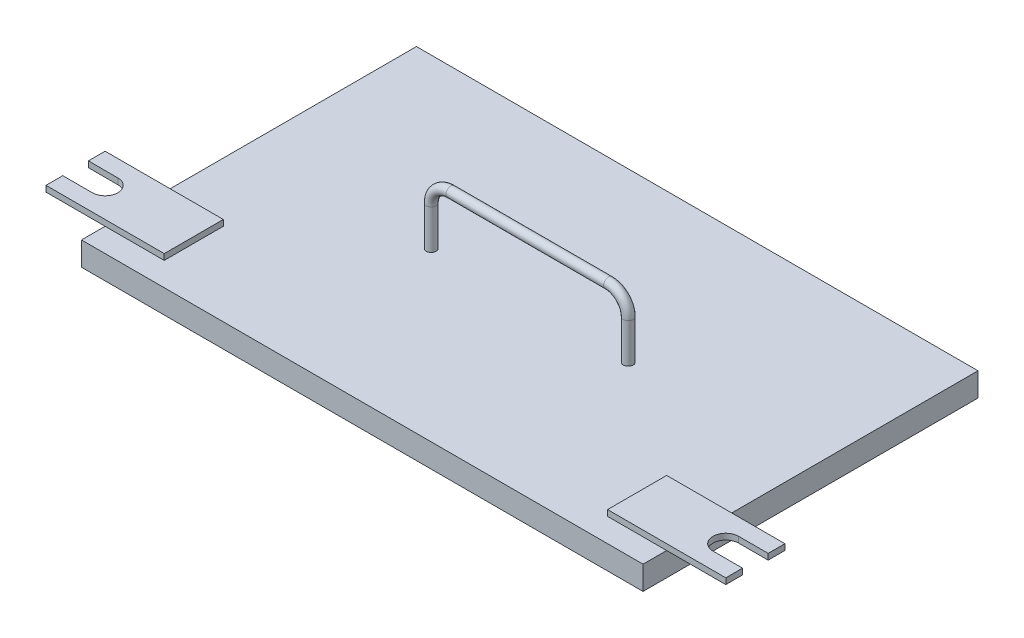
ISO-10303-21;
HEADER;
FILE_DESCRIPTION(('STEP AP214'),'2;1');
FILE_NAME('part.step','',(''),(''),'','','');
FILE_SCHEMA(('AUTOMOTIVE_DESIGN { 1 0 10303 214 1 1 1 1 }'));
ENDSEC;
DATA;
#1=APPLICATION_CONTEXT('core data for automotive mechanical design processes');
#2=APPLICATION_PROTOCOL_DEFINITION('international standard','automotive_design',2000,#1);
#3=PRODUCT_CONTEXT('',#1,'mechanical');
#4=PRODUCT('Part','Part','',(#3));
#5=PRODUCT_RELATED_PRODUCT_CATEGORY('part','',(#4));
#6=PRODUCT_DEFINITION_FORMATION('','',#4);
#7=PRODUCT_DEFINITION_CONTEXT('part definition',#1,'design');
#8=PRODUCT_DEFINITION('design','',#6,#7);
#9=PRODUCT_DEFINITION_SHAPE('','',#8);
#10=(LENGTH_UNIT() NAMED_UNIT(*) SI_UNIT(.MILLI.,.METRE.));
#11=(NAMED_UNIT(*) PLANE_ANGLE_UNIT() SI_UNIT($,.RADIAN.));
#12=(NAMED_UNIT(*) SI_UNIT($,.STERADIAN.) SOLID_ANGLE_UNIT());
#13=UNCERTAINTY_MEASURE_WITH_UNIT(LENGTH_MEASURE(1.E-05),#10,'distance_accuracy_value','');
#14=(GEOMETRIC_REPRESENTATION_CONTEXT(3) GLOBAL_UNCERTAINTY_ASSIGNED_CONTEXT((#13)) GLOBAL_UNIT_ASSIGNED_CONTEXT((#10,
#11,#12)) REPRESENTATION_CONTEXT('',''));
#15=CARTESIAN_POINT('',(0.,0.,0.));
#16=DIRECTION('',(0.,0.,1.));
#17=DIRECTION('',(1.,0.,0.));
#18=AXIS2_PLACEMENT_3D('',#15,#16,#17);
#19=CARTESIAN_POINT('',(-172.5,15.,43.0000000000003));
#20=DIRECTION('',(1.,0.,0.));
#21=DIRECTION('',(0.,0.,-1.));
#22=AXIS2_PLACEMENT_3D('',#19,#20,#21);
#23=PLANE('',#22);
#24=DIRECTION('',(0.,0.,1.));
#25=VECTOR('',#24,1.);
#26=CARTESIAN_POINT('',(-172.5,15.,43.0000000000003));
#27=LINE('',#26,#25);
#28=CARTESIAN_POINT('',(-172.5,15.0000000000001,64.5));
#29=VERTEX_POINT('',#28);
#30=CARTESIAN_POINT('',(-172.5,15.,73.0000000000003));
#31=VERTEX_POINT('',#30);
#32=EDGE_CURVE('E228',#29,#31,#27,.T.);
#33=ORIENTED_EDGE('',*,*,#32,.F.);
#34=DIRECTION('',(0.,-1.,0.));
#35=VECTOR('',#34,1.);
#36=CARTESIAN_POINT('',(-172.5,502.719991967477,64.5));
#37=LINE('',#36,#35);
#38=CARTESIAN_POINT('',(-172.5,12.0000000000001,64.5));
#39=VERTEX_POINT('',#38);
#40=EDGE_CURVE('E188',#29,#39,#37,.T.);
#41=ORIENTED_EDGE('',*,*,#40,.T.);
#42=DIRECTION('',(0.,0.,1.));
#43=VECTOR('',#42,1.);
#44=CARTESIAN_POINT('',(-172.5,12.,43.0000000000003));
#45=LINE('',#44,#43);
#46=CARTESIAN_POINT('',(-172.5,12.,73.0000000000003));
#47=VERTEX_POINT('',#46);
#48=EDGE_CURVE('E241',#39,#47,#45,.T.);
#49=ORIENTED_EDGE('',*,*,#48,.T.);
#50=DIRECTION('',(0.,-1.,0.));
#51=VECTOR('',#50,1.);
#52=CARTESIAN_POINT('',(-172.5,15.,73.0000000000003));
#53=LINE('',#52,#51);
#54=EDGE_CURVE('E249',#31,#47,#53,.T.);
#55=ORIENTED_EDGE('',*,*,#54,.F.);
#56=EDGE_LOOP('',(#33,#41,#49,#55));
#57=FACE_BOUND('',#56,.T.);
#58=ADVANCED_FACE('F32',(#57),#23,.F.);
#59=CARTESIAN_POINT('',(0.,12.,0.));
#60=DIRECTION('',(0.,1.,0.));
#61=DIRECTION('',(0.,0.,1.));
#62=AXIS2_PLACEMENT_3D('',#59,#60,#61);
#63=PLANE('',#62);
#64=DIRECTION('',(-1.,0.,0.));
#65=VECTOR('',#64,1.);
#66=CARTESIAN_POINT('',(0.,12.,64.4999999999998));
#67=LINE('',#66,#65);
#68=CARTESIAN_POINT('',(172.5,12.0000000000001,64.5));
#69=VERTEX_POINT('',#68);
#70=CARTESIAN_POINT('',(157.5,12.0000000000001,64.5));
#71=VERTEX_POINT('',#70);
#72=EDGE_CURVE('E219',#69,#71,#67,.T.);
#73=ORIENTED_EDGE('',*,*,#72,.F.);
#74=DIRECTION('',(0.,0.,-1.));
#75=VECTOR('',#74,1.);
#76=CARTESIAN_POINT('',(172.5,12.,43.));
#77=LINE('',#76,#75);
#78=CARTESIAN_POINT('',(172.5,12.,73.));
#79=VERTEX_POINT('',#78);
#80=EDGE_CURVE('E270',#79,#69,#77,.T.);
#81=ORIENTED_EDGE('',*,*,#80,.F.);
#82=DIRECTION('',(1.,0.,0.));
#83=VECTOR('',#82,1.);
#84=CARTESIAN_POINT('',(112.5,12.,73.));
#85=LINE('',#84,#83);
#86=CARTESIAN_POINT('',(142.5,12.,73.));
#87=VERTEX_POINT('',#86);
#88=EDGE_CURVE('E280',#87,#79,#85,.T.);
#89=ORIENTED_EDGE('',*,*,#88,.F.);
#90=DIRECTION('',(0.,0.,-1.));
#91=VECTOR('',#90,1.);
#92=CARTESIAN_POINT('',(142.5,12.,-85.));
#93=LINE('',#92,#91);
#94=CARTESIAN_POINT('',(142.5,12.,43.));
#95=VERTEX_POINT('',#94);
#96=EDGE_CURVE('E328',#87,#95,#93,.T.);
#97=ORIENTED_EDGE('',*,*,#96,.T.);
#98=DIRECTION('',(-1.,0.,0.));
#99=VECTOR('',#98,1.);
#100=CARTESIAN_POINT('',(112.5,12.,43.));
#101=LINE('',#100,#99);
#102=CARTESIAN_POINT('',(172.5,12.,43.));
#103=VERTEX_POINT('',#102);
#104=EDGE_CURVE('E274',#103,#95,#101,.T.);
#105=ORIENTED_EDGE('',*,*,#104,.F.);
#106=CARTESIAN_POINT('',(172.5,12.0000000000001,51.5));
#107=VERTEX_POINT('',#106);
#108=EDGE_CURVE('E258',#107,#103,#77,.T.);
#109=ORIENTED_EDGE('',*,*,#108,.F.);
#110=DIRECTION('',(1.,0.,0.));
#111=VECTOR('',#110,1.);
#112=CARTESIAN_POINT('',(0.,12.,51.5000000000002));
#113=LINE('',#112,#111);
#114=CARTESIAN_POINT('',(157.5,12.0000000000001,51.5));
#115=VERTEX_POINT('',#114);
#116=EDGE_CURVE('E215',#115,#107,#113,.T.);
#117=ORIENTED_EDGE('',*,*,#116,.F.);
#118=CARTESIAN_POINT('',(157.5,12.,58.));
#119=DIRECTION('',(0.,1.,0.));
#120=DIRECTION('',(0.,0.,1.));
#121=AXIS2_PLACEMENT_3D('',#118,#119,#120);
#122=CIRCLE('',#121,6.49999999999998);
#123=EDGE_CURVE('E217',#71,#115,#122,.F.);
#124=ORIENTED_EDGE('',*,*,#123,.F.);
#125=EDGE_LOOP('',(#73,#81,#89,#97,#105,#109,#117,#124));
#126=FACE_BOUND('',#125,.T.);
#127=ADVANCED_FACE('F410',(#126),#63,.F.);
#128=CARTESIAN_POINT('',(172.5,15.,43.));
#129=DIRECTION('',(-1.,0.,0.));
#130=DIRECTION('',(0.,0.,1.));
#131=AXIS2_PLACEMENT_3D('',#128,#129,#130);
#132=PLANE('',#131);
#133=DIRECTION('',(0.,-1.,0.));
#134=VECTOR('',#133,1.);
#135=CARTESIAN_POINT('',(172.5,502.719991967477,64.5));
#136=LINE('',#135,#134);
#137=CARTESIAN_POINT('',(172.5,15.0000000000001,64.5));
#138=VERTEX_POINT('',#137);
#139=EDGE_CURVE('E213',#138,#69,#136,.T.);
#140=ORIENTED_EDGE('',*,*,#139,.F.);
#141=DIRECTION('',(0.,0.,-1.));
#142=VECTOR('',#141,1.);
#143=CARTESIAN_POINT('',(172.5,15.,43.));
#144=LINE('',#143,#142);
#145=CARTESIAN_POINT('',(172.5,15.,73.));
#146=VERTEX_POINT('',#145);
#147=EDGE_CURVE('E259',#146,#138,#144,.T.);
#148=ORIENTED_EDGE('',*,*,#147,.F.);
#149=DIRECTION('',(0.,-1.,0.));
#150=VECTOR('',#149,1.);
#151=CARTESIAN_POINT('',(172.5,15.,73.));
#152=LINE('',#151,#150);
#153=EDGE_CURVE('E269',#146,#79,#152,.T.);
#154=ORIENTED_EDGE('',*,*,#153,.T.);
#155=ORIENTED_EDGE('',*,*,#80,.T.);
#156=EDGE_LOOP('',(#140,#148,#154,#155));
#157=FACE_BOUND('',#156,.T.);
#158=ADVANCED_FACE('F443',(#157),#132,.F.);
#159=DIRECTION('',(0.,-1.,0.));
#160=VECTOR('',#159,1.);
#161=CARTESIAN_POINT('',(172.5,502.719991967477,51.5));
#162=LINE('',#161,#160);
#163=CARTESIAN_POINT('',(172.5,15.,51.5));
#164=VERTEX_POINT('',#163);
#165=EDGE_CURVE('E55',#164,#107,#162,.T.);
#166=ORIENTED_EDGE('',*,*,#165,.T.);
#167=ORIENTED_EDGE('',*,*,#108,.T.);
#168=DIRECTION('',(0.,-1.,0.));
#169=VECTOR('',#168,1.);
#170=CARTESIAN_POINT('',(172.5,15.,43.));
#171=LINE('',#170,#169);
#172=CARTESIAN_POINT('',(172.5,15.,43.));
#173=VERTEX_POINT('',#172);
#174=EDGE_CURVE('E292',#173,#103,#171,.T.);
#175=ORIENTED_EDGE('',*,*,#174,.F.);
#176=EDGE_CURVE('E263',#164,#173,#144,.T.);
#177=ORIENTED_EDGE('',*,*,#176,.F.);
#178=EDGE_LOOP('',(#166,#167,#175,#177));
#179=FACE_BOUND('',#178,.T.);
#180=ADVANCED_FACE('F431',(#179),#132,.F.);
#181=CARTESIAN_POINT('',(0.,15.,0.));
#182=DIRECTION('',(0.,1.,0.));
#183=DIRECTION('',(0.,0.,1.));
#184=AXIS2_PLACEMENT_3D('',#181,#182,#183);
#185=PLANE('',#184);
#186=ORIENTED_EDGE('',*,*,#147,.T.);
#187=DIRECTION('',(-1.,0.,0.));
#188=VECTOR('',#187,1.);
#189=CARTESIAN_POINT('',(0.,15.,64.4999999999998));
#190=LINE('',#189,#188);
#191=CARTESIAN_POINT('',(157.5,15.0000000000001,64.5));
#192=VERTEX_POINT('',#191);
#193=EDGE_CURVE('E353',#138,#192,#190,.T.);
#194=ORIENTED_EDGE('',*,*,#193,.T.);
#195=CARTESIAN_POINT('',(157.5,15.,58.));
#196=DIRECTION('',(0.,1.,0.));
#197=DIRECTION('',(0.,0.,1.));
#198=AXIS2_PLACEMENT_3D('',#195,#196,#197);
#199=CIRCLE('',#198,6.49999999999998);
#200=CARTESIAN_POINT('',(157.5,15.0000000000001,51.5));
#201=VERTEX_POINT('',#200);
#202=EDGE_CURVE('E350',#192,#201,#199,.F.);
#203=ORIENTED_EDGE('',*,*,#202,.T.);
#204=DIRECTION('',(1.,0.,0.));
#205=VECTOR('',#204,1.);
#206=CARTESIAN_POINT('',(0.,15.,51.5000000000002));
#207=LINE('',#206,#205);
#208=EDGE_CURVE('E314',#201,#164,#207,.T.);
#209=ORIENTED_EDGE('',*,*,#208,.T.);
#210=ORIENTED_EDGE('',*,*,#176,.T.);
#211=DIRECTION('',(-1.,0.,0.));
#212=VECTOR('',#211,1.);
#213=CARTESIAN_POINT('',(112.5,15.,43.));
#214=LINE('',#213,#212);
#215=CARTESIAN_POINT('',(112.5,15.,43.));
#216=VERTEX_POINT('',#215);
#217=EDGE_CURVE('E262',#173,#216,#214,.T.);
#218=ORIENTED_EDGE('',*,*,#217,.T.);
#219=DIRECTION('',(0.,0.,1.));
#220=VECTOR('',#219,1.);
#221=CARTESIAN_POINT('',(112.5,15.,43.));
#222=LINE('',#221,#220);
#223=CARTESIAN_POINT('',(112.5,15.,73.));
#224=VERTEX_POINT('',#223);
#225=EDGE_CURVE('E265',#216,#224,#222,.T.);
#226=ORIENTED_EDGE('',*,*,#225,.T.);
#227=DIRECTION('',(1.,0.,0.));
#228=VECTOR('',#227,1.);
#229=CARTESIAN_POINT('',(112.5,15.,73.));
#230=LINE('',#229,#228);
#231=EDGE_CURVE('E267',#224,#146,#230,.T.);
#232=ORIENTED_EDGE('',*,*,#231,.T.);
#233=EDGE_LOOP('',(#186,#194,#203,#209,#210,#218,#226,#232));
#234=FACE_BOUND('',#233,.T.);
#235=ADVANCED_FACE('F434',(#234),#185,.T.);
#236=CARTESIAN_POINT('',(0.,12.,0.));
#237=DIRECTION('',(0.,-1.,0.));
#238=DIRECTION('',(0.,0.,-1.));
#239=AXIS2_PLACEMENT_3D('',#236,#237,#238);
#240=PLANE('',#239);
#241=CARTESIAN_POINT('',(-50.,12.,0.));
#242=DIRECTION('',(0.,1.,0.));
#243=DIRECTION('',(0.,0.,1.));
#244=AXIS2_PLACEMENT_3D('',#241,#242,#243);
#245=CIRCLE('',#244,2.49999999999999);
#246=CARTESIAN_POINT('',(-50.,12.,2.49999999999999));
#247=VERTEX_POINT('',#246);
#248=EDGE_CURVE('E311',#247,#247,#245,.T.);
#249=ORIENTED_EDGE('',*,*,#248,.F.);
#250=EDGE_LOOP('',(#249));
#251=FACE_BOUND('',#250,.T.);
#252=CARTESIAN_POINT('',(50.0000000000002,12.0000000000004,0.));
#253=DIRECTION('',(0.,-1.,0.));
#254=DIRECTION('',(0.,0.,1.));
#255=AXIS2_PLACEMENT_3D('',#252,#253,#254);
#256=CIRCLE('',#255,2.49999999999999);
#257=CARTESIAN_POINT('',(50.0000000000002,12.0000000000004,2.49999999999999));
#258=VERTEX_POINT('',#257);
#259=EDGE_CURVE('E295',#258,#258,#256,.T.);
#260=ORIENTED_EDGE('',*,*,#259,.T.);
#261=EDGE_LOOP('',(#260));
#262=FACE_BOUND('',#261,.T.);
#263=DIRECTION('',(-1.,0.,0.));
#264=VECTOR('',#263,1.);
#265=CARTESIAN_POINT('',(-112.5,12.,43.0000000000002));
#266=LINE('',#265,#264);
#267=CARTESIAN_POINT('',(-112.5,12.,43.0000000000002));
#268=VERTEX_POINT('',#267);
#269=CARTESIAN_POINT('',(-142.5,12.,43.0000000000002));
#270=VERTEX_POINT('',#269);
#271=EDGE_CURVE('E238',#268,#270,#266,.T.);
#272=ORIENTED_EDGE('',*,*,#271,.F.);
#273=DIRECTION('',(0.,0.,-1.));
#274=VECTOR('',#273,1.);
#275=CARTESIAN_POINT('',(-112.5,12.,43.0000000000002));
#276=LINE('',#275,#274);
#277=CARTESIAN_POINT('',(-112.5,12.,73.0000000000002));
#278=VERTEX_POINT('',#277);
#279=EDGE_CURVE('E221',#278,#268,#276,.T.);
#280=ORIENTED_EDGE('',*,*,#279,.F.);
#281=DIRECTION('',(1.,0.,0.));
#282=VECTOR('',#281,1.);
#283=CARTESIAN_POINT('',(-112.5,12.,73.0000000000002));
#284=LINE('',#283,#282);
#285=CARTESIAN_POINT('',(-142.5,12.,73.0000000000003));
#286=VERTEX_POINT('',#285);
#287=EDGE_CURVE('E244',#286,#278,#284,.T.);
#288=ORIENTED_EDGE('',*,*,#287,.F.);
#289=DIRECTION('',(0.,0.,1.));
#290=VECTOR('',#289,1.);
#291=CARTESIAN_POINT('',(-142.5,12.,-85.));
#292=LINE('',#291,#290);
#293=CARTESIAN_POINT('',(-142.5,12.,85.));
#294=VERTEX_POINT('',#293);
#295=EDGE_CURVE('E321',#286,#294,#292,.T.);
#296=ORIENTED_EDGE('',*,*,#295,.T.);
#297=DIRECTION('',(1.,0.,0.));
#298=VECTOR('',#297,1.);
#299=CARTESIAN_POINT('',(142.5,12.,85.));
#300=LINE('',#299,#298);
#301=CARTESIAN_POINT('',(142.5,12.,85.));
#302=VERTEX_POINT('',#301);
#303=EDGE_CURVE('E319',#294,#302,#300,.T.);
#304=ORIENTED_EDGE('',*,*,#303,.T.);
#305=EDGE_CURVE('E324',#302,#87,#93,.T.);
#306=ORIENTED_EDGE('',*,*,#305,.T.);
#307=CARTESIAN_POINT('',(112.5,12.,73.));
#308=VERTEX_POINT('',#307);
#309=EDGE_CURVE('E281',#308,#87,#85,.T.);
#310=ORIENTED_EDGE('',*,*,#309,.F.);
#311=DIRECTION('',(0.,0.,1.));
#312=VECTOR('',#311,1.);
#313=CARTESIAN_POINT('',(112.5,12.,43.));
#314=LINE('',#313,#312);
#315=CARTESIAN_POINT('',(112.5,12.,43.));
#316=VERTEX_POINT('',#315);
#317=EDGE_CURVE('E277',#316,#308,#314,.T.);
#318=ORIENTED_EDGE('',*,*,#317,.F.);
#319=EDGE_CURVE('E273',#95,#316,#101,.T.);
#320=ORIENTED_EDGE('',*,*,#319,.F.);
#321=CARTESIAN_POINT('',(142.5,12.,-85.));
#322=VERTEX_POINT('',#321);
#323=EDGE_CURVE('E323',#95,#322,#93,.T.);
#324=ORIENTED_EDGE('',*,*,#323,.T.);
#325=DIRECTION('',(-1.,0.,0.));
#326=VECTOR('',#325,1.);
#327=CARTESIAN_POINT('',(142.5,12.,-85.));
#328=LINE('',#327,#326);
#329=CARTESIAN_POINT('',(-142.5,12.,-85.));
#330=VERTEX_POINT('',#329);
#331=EDGE_CURVE('E327',#322,#330,#328,.T.);
#332=ORIENTED_EDGE('',*,*,#331,.T.);
#333=EDGE_CURVE('E316',#330,#270,#292,.T.);
#334=ORIENTED_EDGE('',*,*,#333,.T.);
#335=EDGE_LOOP('',(#272,#280,#288,#296,#304,#306,#310,#318,#320,#324,#332,#334));
#336=FACE_BOUND('',#335,.T.);
#337=ADVANCED_FACE('F386',(#251,#262,#336),#240,.F.);
#338=CARTESIAN_POINT('',(-142.5,12.,-85.));
#339=DIRECTION('',(1.,0.,0.));
#340=DIRECTION('',(0.,0.,-1.));
#341=AXIS2_PLACEMENT_3D('',#338,#339,#340);
#342=PLANE('',#341);
#343=DIRECTION('',(0.,0.,1.));
#344=VECTOR('',#343,1.);
#345=CARTESIAN_POINT('',(-142.5,0.,-85.));
#346=LINE('',#345,#344);
#347=CARTESIAN_POINT('',(-142.5,0.,-85.));
#348=VERTEX_POINT('',#347);
#349=CARTESIAN_POINT('',(-142.5,0.,85.));
#350=VERTEX_POINT('',#349);
#351=EDGE_CURVE('E310',#348,#350,#346,.T.);
#352=ORIENTED_EDGE('',*,*,#351,.T.);
#353=DIRECTION('',(0.,-1.,0.));
#354=VECTOR('',#353,1.);
#355=CARTESIAN_POINT('',(-142.5,12.,85.));
#356=LINE('',#355,#354);
#357=EDGE_CURVE('E315',#294,#350,#356,.T.);
#358=ORIENTED_EDGE('',*,*,#357,.F.);
#359=ORIENTED_EDGE('',*,*,#295,.F.);
#360=EDGE_CURVE('E320',#270,#286,#292,.T.);
#361=ORIENTED_EDGE('',*,*,#360,.F.);
#362=ORIENTED_EDGE('',*,*,#333,.F.);
#363=DIRECTION('',(0.,-1.,0.));
#364=VECTOR('',#363,1.);
#365=CARTESIAN_POINT('',(-142.5,12.,-85.));
#366=LINE('',#365,#364);
#367=EDGE_CURVE('E330',#330,#348,#366,.T.);
#368=ORIENTED_EDGE('',*,*,#367,.T.);
#369=EDGE_LOOP('',(#352,#358,#359,#361,#362,#368));
#370=FACE_BOUND('',#369,.T.);
#371=ADVANCED_FACE('F34',(#370),#342,.F.);
#372=CARTESIAN_POINT('',(142.5,12.,85.));
#373=DIRECTION('',(0.,0.,-1.));
#374=DIRECTION('',(-1.,0.,0.));
#375=AXIS2_PLACEMENT_3D('',#372,#373,#374);
#376=PLANE('',#375);
#377=DIRECTION('',(1.,0.,0.));
#378=VECTOR('',#377,1.);
#379=CARTESIAN_POINT('',(142.5,0.,85.));
#380=LINE('',#379,#378);
#381=CARTESIAN_POINT('',(142.5,0.,85.));
#382=VERTEX_POINT('',#381);
#383=EDGE_CURVE('E333',#350,#382,#380,.T.);
#384=ORIENTED_EDGE('',*,*,#383,.T.);
#385=DIRECTION('',(0.,-1.,0.));
#386=VECTOR('',#385,1.);
#387=CARTESIAN_POINT('',(142.5,12.,85.));
#388=LINE('',#387,#386);
#389=EDGE_CURVE('E344',#302,#382,#388,.T.);
#390=ORIENTED_EDGE('',*,*,#389,.F.);
#391=ORIENTED_EDGE('',*,*,#303,.F.);
#392=ORIENTED_EDGE('',*,*,#357,.T.);
#393=EDGE_LOOP('',(#384,#390,#391,#392));
#394=FACE_BOUND('',#393,.T.);
#395=ADVANCED_FACE('F396',(#394),#376,.F.);
#396=CARTESIAN_POINT('',(142.5,12.,-85.));
#397=DIRECTION('',(-1.,0.,0.));
#398=DIRECTION('',(0.,0.,1.));
#399=AXIS2_PLACEMENT_3D('',#396,#397,#398);
#400=PLANE('',#399);
#401=DIRECTION('',(0.,0.,-1.));
#402=VECTOR('',#401,1.);
#403=CARTESIAN_POINT('',(142.5,0.,-85.));
#404=LINE('',#403,#402);
#405=CARTESIAN_POINT('',(142.5,0.,-85.));
#406=VERTEX_POINT('',#405);
#407=EDGE_CURVE('E335',#382,#406,#404,.T.);
#408=ORIENTED_EDGE('',*,*,#407,.T.);
#409=DIRECTION('',(0.,-1.,0.));
#410=VECTOR('',#409,1.);
#411=CARTESIAN_POINT('',(142.5,12.,-85.));
#412=LINE('',#411,#410);
#413=EDGE_CURVE('E341',#322,#406,#412,.T.);
#414=ORIENTED_EDGE('',*,*,#413,.F.);
#415=ORIENTED_EDGE('',*,*,#323,.F.);
#416=ORIENTED_EDGE('',*,*,#96,.F.);
#417=ORIENTED_EDGE('',*,*,#305,.F.);
#418=ORIENTED_EDGE('',*,*,#389,.T.);
#419=EDGE_LOOP('',(#408,#414,#415,#416,#417,#418));
#420=FACE_BOUND('',#419,.T.);
#421=ADVANCED_FACE('F403',(#420),#400,.F.);
#422=CARTESIAN_POINT('',(142.5,12.,-85.));
#423=DIRECTION('',(0.,0.,1.));
#424=DIRECTION('',(1.,0.,0.));
#425=AXIS2_PLACEMENT_3D('',#422,#423,#424);
#426=PLANE('',#425);
#427=DIRECTION('',(-1.,0.,0.));
#428=VECTOR('',#427,1.);
#429=CARTESIAN_POINT('',(142.5,0.,-85.));
#430=LINE('',#429,#428);
#431=EDGE_CURVE('E337',#406,#348,#430,.T.);
#432=ORIENTED_EDGE('',*,*,#431,.T.);
#433=ORIENTED_EDGE('',*,*,#367,.F.);
#434=ORIENTED_EDGE('',*,*,#331,.F.);
#435=ORIENTED_EDGE('',*,*,#413,.T.);
#436=EDGE_LOOP('',(#432,#433,#434,#435));
#437=FACE_BOUND('',#436,.T.);
#438=ADVANCED_FACE('F507',(#437),#426,.F.);
#439=CARTESIAN_POINT('',(0.,0.,0.));
#440=DIRECTION('',(0.,-1.,0.));
#441=DIRECTION('',(0.,0.,-1.));
#442=AXIS2_PLACEMENT_3D('',#439,#440,#441);
#443=PLANE('',#442);
#444=ORIENTED_EDGE('',*,*,#351,.F.);
#445=ORIENTED_EDGE('',*,*,#431,.F.);
#446=ORIENTED_EDGE('',*,*,#407,.F.);
#447=ORIENTED_EDGE('',*,*,#383,.F.);
#448=EDGE_LOOP('',(#444,#445,#446,#447));
#449=FACE_BOUND('',#448,.T.);
#450=ADVANCED_FACE('F400',(#449),#443,.T.);
#451=CARTESIAN_POINT('',(50.0000000000002,12.0000000000004,0.));
#452=DIRECTION('',(0.,1.,0.));
#453=DIRECTION('',(-1.,0.,0.));
#454=AXIS2_PLACEMENT_3D('',#451,#452,#453);
#455=CYLINDRICAL_SURFACE('',#454,2.49999999999999);
#456=CARTESIAN_POINT('',(50.0000000000001,32.,0.));
#457=DIRECTION('',(0.,-1.,0.));
#458=DIRECTION('',(0.,0.,1.));
#459=AXIS2_PLACEMENT_3D('',#456,#457,#458);
#460=CIRCLE('',#459,2.49999999999999);
#461=CARTESIAN_POINT('',(52.5000000000001,32.,0.));
#462=VERTEX_POINT('',#461);
#463=EDGE_CURVE('E298',#462,#462,#460,.T.);
#464=ORIENTED_EDGE('',*,*,#463,.T.);
#465=EDGE_LOOP('',(#464));
#466=FACE_BOUND('',#465,.T.);
#467=ORIENTED_EDGE('',*,*,#259,.F.);
#468=EDGE_LOOP('',(#467));
#469=FACE_BOUND('',#468,.T.);
#470=ADVANCED_FACE('F481',(#466,#469),#455,.T.);
#471=CARTESIAN_POINT('',(40.0000000000001,32.,0.));
#472=DIRECTION('',(0.,0.,1.));
#473=DIRECTION('',(1.,0.,0.));
#474=AXIS2_PLACEMENT_3D('',#471,#472,#473);
#475=TOROIDAL_SURFACE('',#474,10.,2.49999999999999);
#476=CARTESIAN_POINT('',(40.,42.,0.));
#477=DIRECTION('',(1.,0.,0.));
#478=DIRECTION('',(0.,0.,1.));
#479=AXIS2_PLACEMENT_3D('',#476,#477,#478);
#480=CIRCLE('',#479,2.49999999999999);
#481=CARTESIAN_POINT('',(40.,44.5,0.));
#482=VERTEX_POINT('',#481);
#483=EDGE_CURVE('E301',#482,#482,#480,.T.);
#484=CARTESIAN_POINT('',(40.0000000000001,32.,0.));
#485=DIRECTION('',(0.,0.,1.));
#486=DIRECTION('',(1.,0.,0.));
#487=AXIS2_PLACEMENT_3D('',#484,#485,#486);
#488=CIRCLE('',#487,12.5);
#489=EDGE_CURVE('',#462,#482,#488,.T.);
#490=ORIENTED_EDGE('',*,*,#463,.F.);
#491=ORIENTED_EDGE('',*,*,#483,.T.);
#492=ORIENTED_EDGE('',*,*,#489,.T.);
#493=ORIENTED_EDGE('',*,*,#489,.F.);
#494=EDGE_LOOP('',(#490,#492,#491,#493));
#495=FACE_BOUND('',#494,.T.);
#496=ADVANCED_FACE('F486',(#495),#475,.T.);
#497=CARTESIAN_POINT('',(40.,42.,0.));
#498=DIRECTION('',(-1.,0.,0.));
#499=DIRECTION('',(0.,0.,1.));
#500=AXIS2_PLACEMENT_3D('',#497,#498,#499);
#501=CYLINDRICAL_SURFACE('',#500,2.49999999999999);
#502=CARTESIAN_POINT('',(-39.9999999999999,42.,0.));
#503=DIRECTION('',(1.,0.,0.));
#504=DIRECTION('',(0.,0.,1.));
#505=AXIS2_PLACEMENT_3D('',#502,#503,#504);
#506=CIRCLE('',#505,2.49999999999999);
#507=CARTESIAN_POINT('',(-39.9999999999999,44.5,0.));
#508=VERTEX_POINT('',#507);
#509=EDGE_CURVE('E304',#508,#508,#506,.T.);
#510=ORIENTED_EDGE('',*,*,#509,.T.);
#511=EDGE_LOOP('',(#510));
#512=FACE_BOUND('',#511,.T.);
#513=ORIENTED_EDGE('',*,*,#483,.F.);
#514=EDGE_LOOP('',(#513));
#515=FACE_BOUND('',#514,.T.);
#516=ADVANCED_FACE('F490',(#512,#515),#501,.T.);
#517=CARTESIAN_POINT('',(-40.,32.,0.));
#518=DIRECTION('',(0.,0.,1.));
#519=DIRECTION('',(1.,0.,0.));
#520=AXIS2_PLACEMENT_3D('',#517,#518,#519);
#521=TOROIDAL_SURFACE('',#520,10.,2.49999999999999);
#522=CARTESIAN_POINT('',(-50.,32.,0.));
#523=DIRECTION('',(0.,1.,0.));
#524=DIRECTION('',(0.,0.,1.));
#525=AXIS2_PLACEMENT_3D('',#522,#523,#524);
#526=CIRCLE('',#525,2.49999999999999);
#527=CARTESIAN_POINT('',(-52.5,32.,0.));
#528=VERTEX_POINT('',#527);
#529=EDGE_CURVE('E307',#528,#528,#526,.T.);
#530=CARTESIAN_POINT('',(-40.,32.,0.));
#531=DIRECTION('',(0.,0.,1.));
#532=DIRECTION('',(1.,0.,0.));
#533=AXIS2_PLACEMENT_3D('',#530,#531,#532);
#534=CIRCLE('',#533,12.5);
#535=EDGE_CURVE('',#508,#528,#534,.T.);
#536=ORIENTED_EDGE('',*,*,#509,.F.);
#537=ORIENTED_EDGE('',*,*,#529,.T.);
#538=ORIENTED_EDGE('',*,*,#535,.T.);
#539=ORIENTED_EDGE('',*,*,#535,.F.);
#540=EDGE_LOOP('',(#536,#538,#537,#539));
#541=FACE_BOUND('',#540,.T.);
#542=ADVANCED_FACE('F494',(#541),#521,.T.);
#543=CARTESIAN_POINT('',(-50.,31.9999999999999,0.));
#544=DIRECTION('',(0.,-1.,0.));
#545=DIRECTION('',(0.,0.,-1.));
#546=AXIS2_PLACEMENT_3D('',#543,#544,#545);
#547=CYLINDRICAL_SURFACE('',#546,2.49999999999999);
#548=ORIENTED_EDGE('',*,*,#248,.T.);
#549=EDGE_LOOP('',(#548));
#550=FACE_BOUND('',#549,.T.);
#551=ORIENTED_EDGE('',*,*,#529,.F.);
#552=EDGE_LOOP('',(#551));
#553=FACE_BOUND('',#552,.T.);
#554=ADVANCED_FACE('F480',(#550,#553),#547,.T.);
#555=CARTESIAN_POINT('',(112.5,15.,43.));
#556=DIRECTION('',(0.,0.,1.));
#557=DIRECTION('',(1.,0.,0.));
#558=AXIS2_PLACEMENT_3D('',#555,#556,#557);
#559=PLANE('',#558);
#560=ORIENTED_EDGE('',*,*,#104,.T.);
#561=ORIENTED_EDGE('',*,*,#319,.T.);
#562=DIRECTION('',(0.,-1.,0.));
#563=VECTOR('',#562,1.);
#564=CARTESIAN_POINT('',(112.5,15.,43.));
#565=LINE('',#564,#563);
#566=EDGE_CURVE('E289',#216,#316,#565,.T.);
#567=ORIENTED_EDGE('',*,*,#566,.F.);
#568=ORIENTED_EDGE('',*,*,#217,.F.);
#569=ORIENTED_EDGE('',*,*,#174,.T.);
#570=EDGE_LOOP('',(#560,#561,#567,#568,#569));
#571=FACE_BOUND('',#570,.T.);
#572=ADVANCED_FACE('F424',(#571),#559,.F.);
#573=CARTESIAN_POINT('',(112.5,15.,43.));
#574=DIRECTION('',(1.,0.,0.));
#575=DIRECTION('',(0.,0.,-1.));
#576=AXIS2_PLACEMENT_3D('',#573,#574,#575);
#577=PLANE('',#576);
#578=ORIENTED_EDGE('',*,*,#317,.T.);
#579=DIRECTION('',(0.,-1.,0.));
#580=VECTOR('',#579,1.);
#581=CARTESIAN_POINT('',(112.5,15.,73.));
#582=LINE('',#581,#580);
#583=EDGE_CURVE('E286',#224,#308,#582,.T.);
#584=ORIENTED_EDGE('',*,*,#583,.F.);
#585=ORIENTED_EDGE('',*,*,#225,.F.);
#586=ORIENTED_EDGE('',*,*,#566,.T.);
#587=EDGE_LOOP('',(#578,#584,#585,#586));
#588=FACE_BOUND('',#587,.T.);
#589=ADVANCED_FACE('F419',(#588),#577,.F.);
#590=CARTESIAN_POINT('',(112.5,15.,73.));
#591=DIRECTION('',(0.,0.,-1.));
#592=DIRECTION('',(-1.,0.,0.));
#593=AXIS2_PLACEMENT_3D('',#590,#591,#592);
#594=PLANE('',#593);
#595=ORIENTED_EDGE('',*,*,#309,.T.);
#596=ORIENTED_EDGE('',*,*,#88,.T.);
#597=ORIENTED_EDGE('',*,*,#153,.F.);
#598=ORIENTED_EDGE('',*,*,#231,.F.);
#599=ORIENTED_EDGE('',*,*,#583,.T.);
#600=EDGE_LOOP('',(#595,#596,#597,#598,#599));
#601=FACE_BOUND('',#600,.T.);
#602=ADVANCED_FACE('F414',(#601),#594,.F.);
#603=CARTESIAN_POINT('',(0.,12.,0.));
#604=DIRECTION('',(0.,-1.,0.));
#605=DIRECTION('',(0.,0.,-1.));
#606=AXIS2_PLACEMENT_3D('',#603,#604,#605);
#607=PLANE('',#606);
#608=DIRECTION('',(-1.,0.,0.));
#609=VECTOR('',#608,1.);
#610=CARTESIAN_POINT('',(0.,12.,64.4999999999998));
#611=LINE('',#610,#609);
#612=CARTESIAN_POINT('',(-157.5,12.0000000000001,64.5));
#613=VERTEX_POINT('',#612);
#614=EDGE_CURVE('E201',#613,#39,#611,.T.);
#615=ORIENTED_EDGE('',*,*,#614,.F.);
#616=CARTESIAN_POINT('',(-157.5,12.,58.));
#617=DIRECTION('',(0.,-1.,0.));
#618=DIRECTION('',(0.,0.,-1.));
#619=AXIS2_PLACEMENT_3D('',#616,#617,#618);
#620=CIRCLE('',#619,6.49999999999998);
#621=CARTESIAN_POINT('',(-157.5,12.0000000000001,51.5));
#622=VERTEX_POINT('',#621);
#623=EDGE_CURVE('E187',#622,#613,#620,.T.);
#624=ORIENTED_EDGE('',*,*,#623,.F.);
#625=DIRECTION('',(1.,0.,0.));
#626=VECTOR('',#625,1.);
#627=CARTESIAN_POINT('',(0.,12.,51.5000000000002));
#628=LINE('',#627,#626);
#629=CARTESIAN_POINT('',(-172.5,12.0000000000001,51.5));
#630=VERTEX_POINT('',#629);
#631=EDGE_CURVE('E179',#630,#622,#628,.T.);
#632=ORIENTED_EDGE('',*,*,#631,.F.);
#633=CARTESIAN_POINT('',(-172.5,12.,43.0000000000003));
#634=VERTEX_POINT('',#633);
#635=EDGE_CURVE('E242',#634,#630,#45,.T.);
#636=ORIENTED_EDGE('',*,*,#635,.F.);
#637=EDGE_CURVE('E237',#270,#634,#266,.T.);
#638=ORIENTED_EDGE('',*,*,#637,.F.);
#639=ORIENTED_EDGE('',*,*,#360,.T.);
#640=EDGE_CURVE('E226',#47,#286,#284,.T.);
#641=ORIENTED_EDGE('',*,*,#640,.F.);
#642=ORIENTED_EDGE('',*,*,#48,.F.);
#643=EDGE_LOOP('',(#615,#624,#632,#636,#638,#639,#641,#642));
#644=FACE_BOUND('',#643,.T.);
#645=ADVANCED_FACE('F199',(#644),#607,.T.);
#646=CARTESIAN_POINT('',(-112.5,15.,43.0000000000002));
#647=DIRECTION('',(-1.,0.,0.));
#648=DIRECTION('',(0.,0.,1.));
#649=AXIS2_PLACEMENT_3D('',#646,#647,#648);
#650=PLANE('',#649);
#651=ORIENTED_EDGE('',*,*,#279,.T.);
#652=DIRECTION('',(0.,-1.,0.));
#653=VECTOR('',#652,1.);
#654=CARTESIAN_POINT('',(-112.5,15.,43.0000000000002));
#655=LINE('',#654,#653);
#656=CARTESIAN_POINT('',(-112.5,15.,43.0000000000002));
#657=VERTEX_POINT('',#656);
#658=EDGE_CURVE('E255',#657,#268,#655,.T.);
#659=ORIENTED_EDGE('',*,*,#658,.F.);
#660=DIRECTION('',(0.,0.,-1.));
#661=VECTOR('',#660,1.);
#662=CARTESIAN_POINT('',(-112.5,15.,43.0000000000002));
#663=LINE('',#662,#661);
#664=CARTESIAN_POINT('',(-112.5,15.,73.0000000000002));
#665=VERTEX_POINT('',#664);
#666=EDGE_CURVE('E222',#665,#657,#663,.T.);
#667=ORIENTED_EDGE('',*,*,#666,.F.);
#668=DIRECTION('',(0.,-1.,0.));
#669=VECTOR('',#668,1.);
#670=CARTESIAN_POINT('',(-112.5,15.,73.0000000000002));
#671=LINE('',#670,#669);
#672=EDGE_CURVE('E234',#665,#278,#671,.T.);
#673=ORIENTED_EDGE('',*,*,#672,.T.);
#674=EDGE_LOOP('',(#651,#659,#667,#673));
#675=FACE_BOUND('',#674,.T.);
#676=ADVANCED_FACE('F382',(#675),#650,.F.);
#677=CARTESIAN_POINT('',(-112.5,15.,43.0000000000002));
#678=DIRECTION('',(0.,0.,1.));
#679=DIRECTION('',(1.,0.,0.));
#680=AXIS2_PLACEMENT_3D('',#677,#678,#679);
#681=PLANE('',#680);
#682=ORIENTED_EDGE('',*,*,#271,.T.);
#683=ORIENTED_EDGE('',*,*,#637,.T.);
#684=DIRECTION('',(0.,-1.,0.));
#685=VECTOR('',#684,1.);
#686=CARTESIAN_POINT('',(-172.5,15.,43.0000000000003));
#687=LINE('',#686,#685);
#688=CARTESIAN_POINT('',(-172.5,15.,43.0000000000003));
#689=VERTEX_POINT('',#688);
#690=EDGE_CURVE('E252',#689,#634,#687,.T.);
#691=ORIENTED_EDGE('',*,*,#690,.F.);
#692=DIRECTION('',(-1.,0.,0.));
#693=VECTOR('',#692,1.);
#694=CARTESIAN_POINT('',(-112.5,15.,43.0000000000002));
#695=LINE('',#694,#693);
#696=EDGE_CURVE('E225',#657,#689,#695,.T.);
#697=ORIENTED_EDGE('',*,*,#696,.F.);
#698=ORIENTED_EDGE('',*,*,#658,.T.);
#699=EDGE_LOOP('',(#682,#683,#691,#697,#698));
#700=FACE_BOUND('',#699,.T.);
#701=ADVANCED_FACE('F384',(#700),#681,.F.);
#702=ORIENTED_EDGE('',*,*,#635,.T.);
#703=DIRECTION('',(0.,-1.,0.));
#704=VECTOR('',#703,1.);
#705=CARTESIAN_POINT('',(-172.5,502.719991967477,51.5));
#706=LINE('',#705,#704);
#707=CARTESIAN_POINT('',(-172.5,15.0000000000001,51.5));
#708=VERTEX_POINT('',#707);
#709=EDGE_CURVE('E182',#708,#630,#706,.T.);
#710=ORIENTED_EDGE('',*,*,#709,.F.);
#711=EDGE_CURVE('E229',#689,#708,#27,.T.);
#712=ORIENTED_EDGE('',*,*,#711,.F.);
#713=ORIENTED_EDGE('',*,*,#690,.T.);
#714=EDGE_LOOP('',(#702,#710,#712,#713));
#715=FACE_BOUND('',#714,.T.);
#716=ADVANCED_FACE('F362',(#715),#23,.F.);
#717=CARTESIAN_POINT('',(-112.5,15.,73.0000000000002));
#718=DIRECTION('',(0.,0.,-1.));
#719=DIRECTION('',(-1.,0.,0.));
#720=AXIS2_PLACEMENT_3D('',#717,#718,#719);
#721=PLANE('',#720);
#722=ORIENTED_EDGE('',*,*,#640,.T.);
#723=ORIENTED_EDGE('',*,*,#287,.T.);
#724=ORIENTED_EDGE('',*,*,#672,.F.);
#725=DIRECTION('',(1.,0.,0.));
#726=VECTOR('',#725,1.);
#727=CARTESIAN_POINT('',(-112.5,15.,73.0000000000002));
#728=LINE('',#727,#726);
#729=EDGE_CURVE('E232',#31,#665,#728,.T.);
#730=ORIENTED_EDGE('',*,*,#729,.F.);
#731=ORIENTED_EDGE('',*,*,#54,.T.);
#732=EDGE_LOOP('',(#722,#723,#724,#730,#731));
#733=FACE_BOUND('',#732,.T.);
#734=ADVANCED_FACE('F374',(#733),#721,.F.);
#735=CARTESIAN_POINT('',(0.,15.,0.));
#736=DIRECTION('',(0.,-1.,0.));
#737=DIRECTION('',(0.,0.,-1.));
#738=AXIS2_PLACEMENT_3D('',#735,#736,#737);
#739=PLANE('',#738);
#740=CARTESIAN_POINT('',(-157.5,15.,58.));
#741=DIRECTION('',(0.,-1.,0.));
#742=DIRECTION('',(0.,0.,-1.));
#743=AXIS2_PLACEMENT_3D('',#740,#741,#742);
#744=CIRCLE('',#743,6.49999999999998);
#745=CARTESIAN_POINT('',(-157.5,15.,51.5));
#746=VERTEX_POINT('',#745);
#747=CARTESIAN_POINT('',(-157.5,15.0000000000001,64.5));
#748=VERTEX_POINT('',#747);
#749=EDGE_CURVE('E40',#746,#748,#744,.T.);
#750=ORIENTED_EDGE('',*,*,#749,.T.);
#751=DIRECTION('',(-1.,0.,0.));
#752=VECTOR('',#751,1.);
#753=CARTESIAN_POINT('',(0.,15.,64.4999999999998));
#754=LINE('',#753,#752);
#755=EDGE_CURVE('E11',#748,#29,#754,.T.);
#756=ORIENTED_EDGE('',*,*,#755,.T.);
#757=ORIENTED_EDGE('',*,*,#32,.T.);
#758=ORIENTED_EDGE('',*,*,#729,.T.);
#759=ORIENTED_EDGE('',*,*,#666,.T.);
#760=ORIENTED_EDGE('',*,*,#696,.T.);
#761=ORIENTED_EDGE('',*,*,#711,.T.);
#762=DIRECTION('',(1.,0.,0.));
#763=VECTOR('',#762,1.);
#764=CARTESIAN_POINT('',(0.,15.,51.5000000000002));
#765=LINE('',#764,#763);
#766=EDGE_CURVE('E356',#708,#746,#765,.T.);
#767=ORIENTED_EDGE('',*,*,#766,.T.);
#768=EDGE_LOOP('',(#750,#756,#757,#758,#759,#760,#761,#767));
#769=FACE_BOUND('',#768,.T.);
#770=ADVANCED_FACE('F358',(#769),#739,.F.);
#771=CARTESIAN_POINT('',(172.5,502.719991967477,64.5));
#772=DIRECTION('',(0.,0.,-1.));
#773=DIRECTION('',(-1.,0.,0.));
#774=AXIS2_PLACEMENT_3D('',#771,#772,#773);
#775=PLANE('',#774);
#776=ORIENTED_EDGE('',*,*,#139,.T.);
#777=ORIENTED_EDGE('',*,*,#72,.T.);
#778=DIRECTION('',(0.,-1.,0.));
#779=VECTOR('',#778,1.);
#780=CARTESIAN_POINT('',(157.5,502.719991967477,64.5));
#781=LINE('',#780,#779);
#782=EDGE_CURVE('E210',#192,#71,#781,.T.);
#783=ORIENTED_EDGE('',*,*,#782,.F.);
#784=ORIENTED_EDGE('',*,*,#193,.F.);
#785=EDGE_LOOP('',(#776,#777,#783,#784));
#786=FACE_BOUND('',#785,.T.);
#787=ADVANCED_FACE('F445',(#786),#775,.T.);
#788=CARTESIAN_POINT('',(157.5,502.719991967477,58.));
#789=DIRECTION('',(0.,-1.,0.));
#790=DIRECTION('',(0.,0.,-1.));
#791=AXIS2_PLACEMENT_3D('',#788,#789,#790);
#792=CYLINDRICAL_SURFACE('',#791,6.49999999999998);
#793=ORIENTED_EDGE('',*,*,#782,.T.);
#794=ORIENTED_EDGE('',*,*,#123,.T.);
#795=DIRECTION('',(0.,-1.,0.));
#796=VECTOR('',#795,1.);
#797=CARTESIAN_POINT('',(157.5,502.719991967477,51.5));
#798=LINE('',#797,#796);
#799=EDGE_CURVE('E207',#201,#115,#798,.T.);
#800=ORIENTED_EDGE('',*,*,#799,.F.);
#801=ORIENTED_EDGE('',*,*,#202,.F.);
#802=EDGE_LOOP('',(#793,#794,#800,#801));
#803=FACE_BOUND('',#802,.T.);
#804=ADVANCED_FACE('F438',(#803),#792,.F.);
#805=CARTESIAN_POINT('',(172.5,502.719991967477,51.5));
#806=DIRECTION('',(0.,0.,1.));
#807=DIRECTION('',(1.,0.,0.));
#808=AXIS2_PLACEMENT_3D('',#805,#806,#807);
#809=PLANE('',#808);
#810=ORIENTED_EDGE('',*,*,#799,.T.);
#811=ORIENTED_EDGE('',*,*,#116,.T.);
#812=ORIENTED_EDGE('',*,*,#165,.F.);
#813=ORIENTED_EDGE('',*,*,#208,.F.);
#814=EDGE_LOOP('',(#810,#811,#812,#813));
#815=FACE_BOUND('',#814,.T.);
#816=ADVANCED_FACE('F436',(#815),#809,.T.);
#817=CARTESIAN_POINT('',(-172.5,502.719991967477,64.5));
#818=DIRECTION('',(0.,0.,1.));
#819=DIRECTION('',(1.,0.,0.));
#820=AXIS2_PLACEMENT_3D('',#817,#818,#819);
#821=PLANE('',#820);
#822=DIRECTION('',(0.,-1.,0.));
#823=VECTOR('',#822,1.);
#824=CARTESIAN_POINT('',(-157.5,502.719991967477,64.5));
#825=LINE('',#824,#823);
#826=EDGE_CURVE('E196',#748,#613,#825,.T.);
#827=ORIENTED_EDGE('',*,*,#826,.T.);
#828=ORIENTED_EDGE('',*,*,#614,.T.);
#829=ORIENTED_EDGE('',*,*,#40,.F.);
#830=ORIENTED_EDGE('',*,*,#755,.F.);
#831=EDGE_LOOP('',(#827,#828,#829,#830));
#832=FACE_BOUND('',#831,.T.);
#833=ADVANCED_FACE('F656',(#832),#821,.F.);
#834=CARTESIAN_POINT('',(-157.5,502.719991967477,58.));
#835=DIRECTION('',(0.,-1.,0.));
#836=DIRECTION('',(0.,0.,-1.));
#837=AXIS2_PLACEMENT_3D('',#834,#835,#836);
#838=CYLINDRICAL_SURFACE('',#837,6.49999999999998);
#839=DIRECTION('',(0.,-1.,0.));
#840=VECTOR('',#839,1.);
#841=CARTESIAN_POINT('',(-157.5,502.719991967477,51.5));
#842=LINE('',#841,#840);
#843=EDGE_CURVE('E47',#746,#622,#842,.T.);
#844=ORIENTED_EDGE('',*,*,#843,.T.);
#845=ORIENTED_EDGE('',*,*,#623,.T.);
#846=ORIENTED_EDGE('',*,*,#826,.F.);
#847=ORIENTED_EDGE('',*,*,#749,.F.);
#848=EDGE_LOOP('',(#844,#845,#846,#847));
#849=FACE_BOUND('',#848,.T.);
#850=ADVANCED_FACE('F191',(#849),#838,.F.);
#851=CARTESIAN_POINT('',(-172.5,502.719991967477,51.5));
#852=DIRECTION('',(0.,0.,-1.));
#853=DIRECTION('',(-1.,0.,0.));
#854=AXIS2_PLACEMENT_3D('',#851,#852,#853);
#855=PLANE('',#854);
#856=ORIENTED_EDGE('',*,*,#709,.T.);
#857=ORIENTED_EDGE('',*,*,#631,.T.);
#858=ORIENTED_EDGE('',*,*,#843,.F.);
#859=ORIENTED_EDGE('',*,*,#766,.F.);
#860=EDGE_LOOP('',(#856,#857,#858,#859));
#861=FACE_BOUND('',#860,.T.);
#862=ADVANCED_FACE('F180',(#861),#855,.F.);
#863=CLOSED_SHELL('',(#58,#127,#158,#180,#235,#337,#371,#395,#421,#438,#450,#470,#496,#516,#542,
#554,#572,#589,#602,#645,#676,#701,#716,#734,#770,#787,#804,#816,#833,#850,#862));
#864=MANIFOLD_SOLID_BREP('B2',#863);
#865=ADVANCED_BREP_SHAPE_REPRESENTATION('',(#18,#864),#14);
#866=SHAPE_DEFINITION_REPRESENTATION(#9,#865);
ENDSEC;
END-ISO-10303-21;
